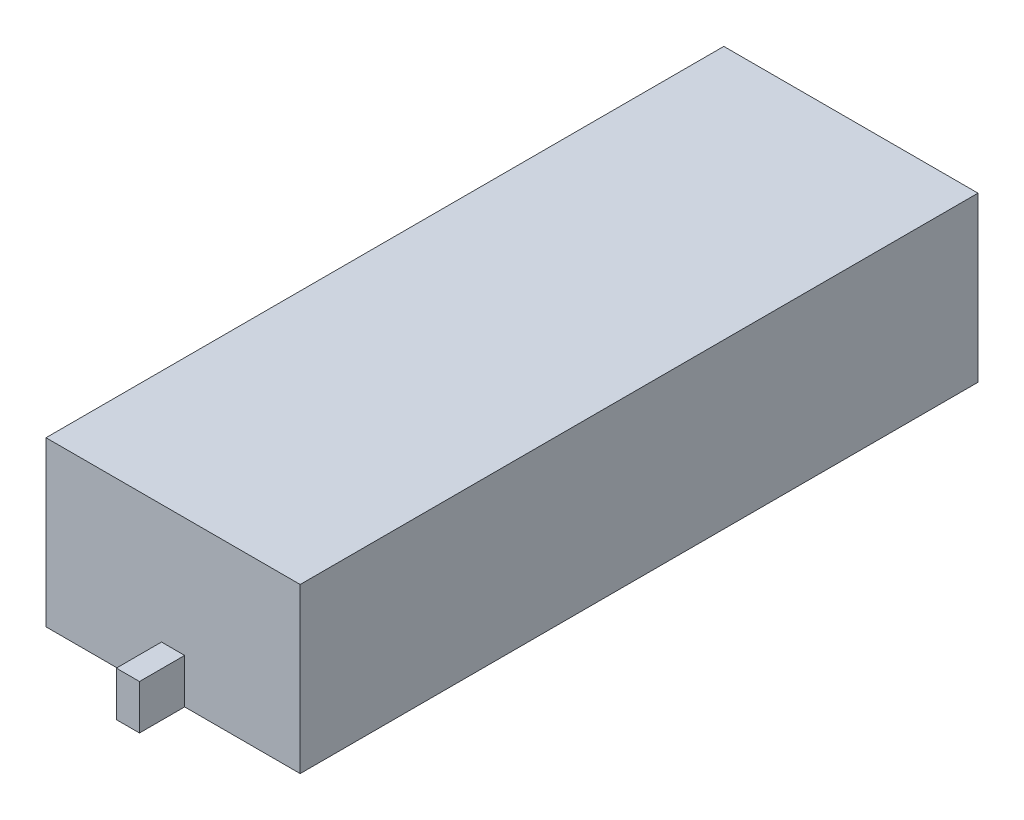
ISO-10303-21;
HEADER;
FILE_DESCRIPTION(('STEP AP214'),'2;1');
FILE_NAME('part.step','',(''),(''),'','','');
FILE_SCHEMA(('AUTOMOTIVE_DESIGN { 1 0 10303 214 1 1 1 1 }'));
ENDSEC;
DATA;
#1=APPLICATION_CONTEXT('core data for automotive mechanical design processes');
#2=APPLICATION_PROTOCOL_DEFINITION('international standard','automotive_design',2000,#1);
#3=PRODUCT_CONTEXT('',#1,'mechanical');
#4=PRODUCT('Part','Part','',(#3));
#5=PRODUCT_RELATED_PRODUCT_CATEGORY('part','',(#4));
#6=PRODUCT_DEFINITION_FORMATION('','',#4);
#7=PRODUCT_DEFINITION_CONTEXT('part definition',#1,'design');
#8=PRODUCT_DEFINITION('design','',#6,#7);
#9=PRODUCT_DEFINITION_SHAPE('','',#8);
#10=(LENGTH_UNIT() NAMED_UNIT(*) SI_UNIT(.MILLI.,.METRE.));
#11=(NAMED_UNIT(*) PLANE_ANGLE_UNIT() SI_UNIT($,.RADIAN.));
#12=(NAMED_UNIT(*) SI_UNIT($,.STERADIAN.) SOLID_ANGLE_UNIT());
#13=UNCERTAINTY_MEASURE_WITH_UNIT(LENGTH_MEASURE(1.E-05),#10,'distance_accuracy_value','');
#14=(GEOMETRIC_REPRESENTATION_CONTEXT(3) GLOBAL_UNCERTAINTY_ASSIGNED_CONTEXT((#13)) GLOBAL_UNIT_ASSIGNED_CONTEXT((#10,
#11,#12)) REPRESENTATION_CONTEXT('',''));
#15=CARTESIAN_POINT('',(0.,0.,0.));
#16=DIRECTION('',(0.,0.,1.));
#17=DIRECTION('',(1.,0.,0.));
#18=AXIS2_PLACEMENT_3D('',#15,#16,#17);
#19=CARTESIAN_POINT('',(-45.,58.,120.));
#20=DIRECTION('',(0.,0.,-1.));
#21=DIRECTION('',(-1.,0.,0.));
#22=AXIS2_PLACEMENT_3D('',#19,#20,#21);
#23=PLANE('',#22);
#24=DIRECTION('',(0.,-1.,0.));
#25=VECTOR('',#24,1.);
#26=CARTESIAN_POINT('',(-4.1,15.8,120.));
#27=LINE('',#26,#25);
#28=CARTESIAN_POINT('',(-4.1,15.8,120.));
#29=VERTEX_POINT('',#28);
#30=CARTESIAN_POINT('',(-4.1,0.,120.));
#31=VERTEX_POINT('',#30);
#32=EDGE_CURVE('E186',#29,#31,#27,.T.);
#33=ORIENTED_EDGE('',*,*,#32,.F.);
#34=DIRECTION('',(-1.,0.,0.));
#35=VECTOR('',#34,1.);
#36=CARTESIAN_POINT('',(-4.1,15.8,120.));
#37=LINE('',#36,#35);
#38=CARTESIAN_POINT('',(4.1,15.8,120.));
#39=VERTEX_POINT('',#38);
#40=EDGE_CURVE('E128',#39,#29,#37,.T.);
#41=ORIENTED_EDGE('',*,*,#40,.F.);
#42=DIRECTION('',(0.,-1.,0.));
#43=VECTOR('',#42,1.);
#44=CARTESIAN_POINT('',(4.1,15.8,120.));
#45=LINE('',#44,#43);
#46=CARTESIAN_POINT('',(4.09999999999999,0.,120.));
#47=VERTEX_POINT('',#46);
#48=EDGE_CURVE('E142',#39,#47,#45,.T.);
#49=ORIENTED_EDGE('',*,*,#48,.T.);
#50=DIRECTION('',(1.,0.,0.));
#51=VECTOR('',#50,1.);
#52=CARTESIAN_POINT('',(-45.,0.,120.));
#53=LINE('',#52,#51);
#54=CARTESIAN_POINT('',(45.,0.,120.));
#55=VERTEX_POINT('',#54);
#56=EDGE_CURVE('E139',#47,#55,#53,.T.);
#57=ORIENTED_EDGE('',*,*,#56,.T.);
#58=DIRECTION('',(0.,-1.,0.));
#59=VECTOR('',#58,1.);
#60=CARTESIAN_POINT('',(45.,58.,120.));
#61=LINE('',#60,#59);
#62=CARTESIAN_POINT('',(45.,58.,120.));
#63=VERTEX_POINT('',#62);
#64=EDGE_CURVE('E50',#63,#55,#61,.T.);
#65=ORIENTED_EDGE('',*,*,#64,.F.);
#66=DIRECTION('',(1.,0.,0.));
#67=VECTOR('',#66,1.);
#68=CARTESIAN_POINT('',(-45.,58.,120.));
#69=LINE('',#68,#67);
#70=CARTESIAN_POINT('',(-45.,58.,120.));
#71=VERTEX_POINT('',#70);
#72=EDGE_CURVE('E93',#71,#63,#69,.T.);
#73=ORIENTED_EDGE('',*,*,#72,.F.);
#74=DIRECTION('',(0.,-1.,0.));
#75=VECTOR('',#74,1.);
#76=CARTESIAN_POINT('',(-45.,58.,120.));
#77=LINE('',#76,#75);
#78=CARTESIAN_POINT('',(-45.,0.,120.));
#79=VERTEX_POINT('',#78);
#80=EDGE_CURVE('E11',#71,#79,#77,.T.);
#81=ORIENTED_EDGE('',*,*,#80,.T.);
#82=EDGE_CURVE('E153',#79,#31,#53,.T.);
#83=ORIENTED_EDGE('',*,*,#82,.T.);
#84=EDGE_LOOP('',(#33,#41,#49,#57,#65,#73,#81,#83));
#85=FACE_BOUND('',#84,.T.);
#86=ADVANCED_FACE('F39',(#85),#23,.F.);
#87=CARTESIAN_POINT('',(-45.,58.,-120.));
#88=DIRECTION('',(1.,0.,0.));
#89=DIRECTION('',(0.,0.,-1.));
#90=AXIS2_PLACEMENT_3D('',#87,#88,#89);
#91=PLANE('',#90);
#92=DIRECTION('',(0.,0.,1.));
#93=VECTOR('',#92,1.);
#94=CARTESIAN_POINT('',(-45.,0.,-120.));
#95=LINE('',#94,#93);
#96=CARTESIAN_POINT('',(-45.,0.,-120.));
#97=VERTEX_POINT('',#96);
#98=EDGE_CURVE('E140',#97,#79,#95,.T.);
#99=ORIENTED_EDGE('',*,*,#98,.T.);
#100=ORIENTED_EDGE('',*,*,#80,.F.);
#101=DIRECTION('',(0.,0.,1.));
#102=VECTOR('',#101,1.);
#103=CARTESIAN_POINT('',(-45.,58.,-120.));
#104=LINE('',#103,#102);
#105=CARTESIAN_POINT('',(-45.,58.,-120.));
#106=VERTEX_POINT('',#105);
#107=EDGE_CURVE('E148',#106,#71,#104,.T.);
#108=ORIENTED_EDGE('',*,*,#107,.F.);
#109=DIRECTION('',(0.,-1.,0.));
#110=VECTOR('',#109,1.);
#111=CARTESIAN_POINT('',(-45.,58.,-120.));
#112=LINE('',#111,#110);
#113=EDGE_CURVE('E151',#106,#97,#112,.T.);
#114=ORIENTED_EDGE('',*,*,#113,.T.);
#115=EDGE_LOOP('',(#99,#100,#108,#114));
#116=FACE_BOUND('',#115,.T.);
#117=ADVANCED_FACE('F41',(#116),#91,.F.);
#118=CARTESIAN_POINT('',(45.,58.,-120.));
#119=DIRECTION('',(-1.,0.,0.));
#120=DIRECTION('',(0.,0.,1.));
#121=AXIS2_PLACEMENT_3D('',#118,#119,#120);
#122=PLANE('',#121);
#123=DIRECTION('',(0.,0.,-1.));
#124=VECTOR('',#123,1.);
#125=CARTESIAN_POINT('',(45.,0.,-120.));
#126=LINE('',#125,#124);
#127=CARTESIAN_POINT('',(45.,0.,-120.));
#128=VERTEX_POINT('',#127);
#129=EDGE_CURVE('E156',#55,#128,#126,.T.);
#130=ORIENTED_EDGE('',*,*,#129,.T.);
#131=DIRECTION('',(0.,-1.,0.));
#132=VECTOR('',#131,1.);
#133=CARTESIAN_POINT('',(45.,58.,-120.));
#134=LINE('',#133,#132);
#135=CARTESIAN_POINT('',(45.,58.,-120.));
#136=VERTEX_POINT('',#135);
#137=EDGE_CURVE('E159',#136,#128,#134,.T.);
#138=ORIENTED_EDGE('',*,*,#137,.F.);
#139=DIRECTION('',(0.,0.,-1.));
#140=VECTOR('',#139,1.);
#141=CARTESIAN_POINT('',(45.,58.,-120.));
#142=LINE('',#141,#140);
#143=EDGE_CURVE('E149',#63,#136,#142,.T.);
#144=ORIENTED_EDGE('',*,*,#143,.F.);
#145=ORIENTED_EDGE('',*,*,#64,.T.);
#146=EDGE_LOOP('',(#130,#138,#144,#145));
#147=FACE_BOUND('',#146,.T.);
#148=ADVANCED_FACE('F164',(#147),#122,.F.);
#149=CARTESIAN_POINT('',(-45.,58.,-120.));
#150=DIRECTION('',(0.,0.,1.));
#151=DIRECTION('',(1.,0.,0.));
#152=AXIS2_PLACEMENT_3D('',#149,#150,#151);
#153=PLANE('',#152);
#154=DIRECTION('',(-1.,0.,0.));
#155=VECTOR('',#154,1.);
#156=CARTESIAN_POINT('',(-45.,0.,-120.));
#157=LINE('',#156,#155);
#158=EDGE_CURVE('E82',#128,#97,#157,.T.);
#159=ORIENTED_EDGE('',*,*,#158,.T.);
#160=ORIENTED_EDGE('',*,*,#113,.F.);
#161=DIRECTION('',(-1.,0.,0.));
#162=VECTOR('',#161,1.);
#163=CARTESIAN_POINT('',(-45.,58.,-120.));
#164=LINE('',#163,#162);
#165=EDGE_CURVE('E62',#136,#106,#164,.T.);
#166=ORIENTED_EDGE('',*,*,#165,.F.);
#167=ORIENTED_EDGE('',*,*,#137,.T.);
#168=EDGE_LOOP('',(#159,#160,#166,#167));
#169=FACE_BOUND('',#168,.T.);
#170=ADVANCED_FACE('F175',(#169),#153,.F.);
#171=CARTESIAN_POINT('',(0.,58.,0.));
#172=DIRECTION('',(0.,1.,0.));
#173=DIRECTION('',(0.,0.,1.));
#174=AXIS2_PLACEMENT_3D('',#171,#172,#173);
#175=PLANE('',#174);
#176=ORIENTED_EDGE('',*,*,#107,.T.);
#177=ORIENTED_EDGE('',*,*,#72,.T.);
#178=ORIENTED_EDGE('',*,*,#143,.T.);
#179=ORIENTED_EDGE('',*,*,#165,.T.);
#180=EDGE_LOOP('',(#176,#177,#178,#179));
#181=FACE_BOUND('',#180,.T.);
#182=ADVANCED_FACE('F176',(#181),#175,.T.);
#183=CARTESIAN_POINT('',(0.,0.,0.));
#184=DIRECTION('',(0.,1.,0.));
#185=DIRECTION('',(0.,0.,1.));
#186=AXIS2_PLACEMENT_3D('',#183,#184,#185);
#187=PLANE('',#186);
#188=ORIENTED_EDGE('',*,*,#98,.F.);
#189=ORIENTED_EDGE('',*,*,#158,.F.);
#190=ORIENTED_EDGE('',*,*,#129,.F.);
#191=ORIENTED_EDGE('',*,*,#56,.F.);
#192=DIRECTION('',(0.,0.,-1.));
#193=VECTOR('',#192,1.);
#194=CARTESIAN_POINT('',(4.1,0.,120.));
#195=LINE('',#194,#193);
#196=CARTESIAN_POINT('',(4.1,0.,136.));
#197=VERTEX_POINT('',#196);
#198=EDGE_CURVE('E53',#197,#47,#195,.T.);
#199=ORIENTED_EDGE('',*,*,#198,.F.);
#200=DIRECTION('',(1.,0.,0.));
#201=VECTOR('',#200,1.);
#202=CARTESIAN_POINT('',(-4.1,0.,136.));
#203=LINE('',#202,#201);
#204=CARTESIAN_POINT('',(-4.1,0.,136.));
#205=VERTEX_POINT('',#204);
#206=EDGE_CURVE('E194',#205,#197,#203,.T.);
#207=ORIENTED_EDGE('',*,*,#206,.F.);
#208=DIRECTION('',(0.,0.,1.));
#209=VECTOR('',#208,1.);
#210=CARTESIAN_POINT('',(-4.1,0.,120.));
#211=LINE('',#210,#209);
#212=EDGE_CURVE('E136',#31,#205,#211,.T.);
#213=ORIENTED_EDGE('',*,*,#212,.F.);
#214=ORIENTED_EDGE('',*,*,#82,.F.);
#215=EDGE_LOOP('',(#188,#189,#190,#191,#199,#207,#213,#214));
#216=FACE_BOUND('',#215,.T.);
#217=ADVANCED_FACE('F168',(#216),#187,.F.);
#218=CARTESIAN_POINT('',(-4.1,15.8,120.));
#219=DIRECTION('',(1.,0.,0.));
#220=DIRECTION('',(0.,0.,-1.));
#221=AXIS2_PLACEMENT_3D('',#218,#219,#220);
#222=PLANE('',#221);
#223=ORIENTED_EDGE('',*,*,#212,.T.);
#224=DIRECTION('',(0.,-1.,0.));
#225=VECTOR('',#224,1.);
#226=CARTESIAN_POINT('',(-4.1,15.8,136.));
#227=LINE('',#226,#225);
#228=CARTESIAN_POINT('',(-4.1,15.8,136.));
#229=VERTEX_POINT('',#228);
#230=EDGE_CURVE('E120',#229,#205,#227,.T.);
#231=ORIENTED_EDGE('',*,*,#230,.F.);
#232=DIRECTION('',(0.,0.,1.));
#233=VECTOR('',#232,1.);
#234=CARTESIAN_POINT('',(-4.1,15.8,120.));
#235=LINE('',#234,#233);
#236=EDGE_CURVE('E124',#29,#229,#235,.T.);
#237=ORIENTED_EDGE('',*,*,#236,.F.);
#238=ORIENTED_EDGE('',*,*,#32,.T.);
#239=EDGE_LOOP('',(#223,#231,#237,#238));
#240=FACE_BOUND('',#239,.T.);
#241=ADVANCED_FACE('F135',(#240),#222,.F.);
#242=CARTESIAN_POINT('',(-4.1,15.8,136.));
#243=DIRECTION('',(0.,0.,-1.));
#244=DIRECTION('',(-1.,0.,0.));
#245=AXIS2_PLACEMENT_3D('',#242,#243,#244);
#246=PLANE('',#245);
#247=ORIENTED_EDGE('',*,*,#206,.T.);
#248=DIRECTION('',(0.,-1.,0.));
#249=VECTOR('',#248,1.);
#250=CARTESIAN_POINT('',(4.1,15.8,136.));
#251=LINE('',#250,#249);
#252=CARTESIAN_POINT('',(4.1,15.8,136.));
#253=VERTEX_POINT('',#252);
#254=EDGE_CURVE('E121',#253,#197,#251,.T.);
#255=ORIENTED_EDGE('',*,*,#254,.F.);
#256=DIRECTION('',(1.,0.,0.));
#257=VECTOR('',#256,1.);
#258=CARTESIAN_POINT('',(-4.1,15.8,136.));
#259=LINE('',#258,#257);
#260=EDGE_CURVE('E113',#229,#253,#259,.T.);
#261=ORIENTED_EDGE('',*,*,#260,.F.);
#262=ORIENTED_EDGE('',*,*,#230,.T.);
#263=EDGE_LOOP('',(#247,#255,#261,#262));
#264=FACE_BOUND('',#263,.T.);
#265=ADVANCED_FACE('F119',(#264),#246,.F.);
#266=CARTESIAN_POINT('',(4.1,15.8,120.));
#267=DIRECTION('',(-1.,0.,0.));
#268=DIRECTION('',(0.,0.,1.));
#269=AXIS2_PLACEMENT_3D('',#266,#267,#268);
#270=PLANE('',#269);
#271=ORIENTED_EDGE('',*,*,#198,.T.);
#272=ORIENTED_EDGE('',*,*,#48,.F.);
#273=DIRECTION('',(0.,0.,-1.));
#274=VECTOR('',#273,1.);
#275=CARTESIAN_POINT('',(4.1,15.8,120.));
#276=LINE('',#275,#274);
#277=EDGE_CURVE('E122',#253,#39,#276,.T.);
#278=ORIENTED_EDGE('',*,*,#277,.F.);
#279=ORIENTED_EDGE('',*,*,#254,.T.);
#280=EDGE_LOOP('',(#271,#272,#278,#279));
#281=FACE_BOUND('',#280,.T.);
#282=ADVANCED_FACE('F196',(#281),#270,.F.);
#283=CARTESIAN_POINT('',(0.,15.8,0.));
#284=DIRECTION('',(0.,1.,0.));
#285=DIRECTION('',(0.,0.,1.));
#286=AXIS2_PLACEMENT_3D('',#283,#284,#285);
#287=PLANE('',#286);
#288=ORIENTED_EDGE('',*,*,#236,.T.);
#289=ORIENTED_EDGE('',*,*,#260,.T.);
#290=ORIENTED_EDGE('',*,*,#277,.T.);
#291=ORIENTED_EDGE('',*,*,#40,.T.);
#292=EDGE_LOOP('',(#288,#289,#290,#291));
#293=FACE_BOUND('',#292,.T.);
#294=ADVANCED_FACE('F126',(#293),#287,.T.);
#295=CLOSED_SHELL('',(#86,#117,#148,#170,#182,#217,#241,#265,#282,#294));
#296=MANIFOLD_SOLID_BREP('B2',#295);
#297=ADVANCED_BREP_SHAPE_REPRESENTATION('',(#18,#296),#14);
#298=SHAPE_DEFINITION_REPRESENTATION(#9,#297);
ENDSEC;
END-ISO-10303-21;
